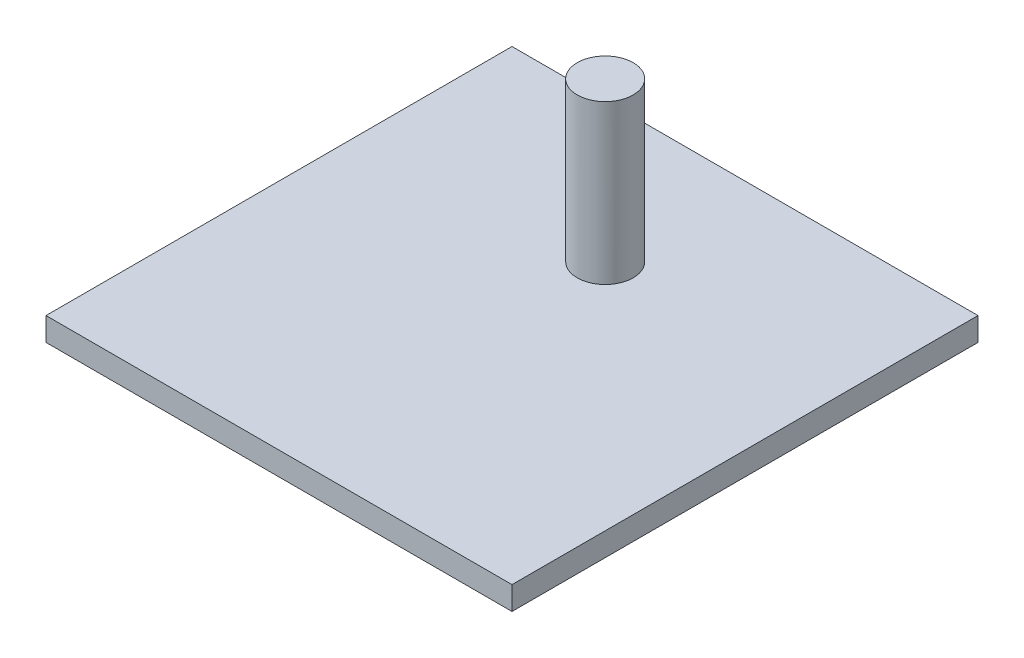
ISO-10303-21;
HEADER;
FILE_DESCRIPTION(('STEP AP214'),'2;1');
FILE_NAME('part.step','',(''),(''),'','','');
FILE_SCHEMA(('AUTOMOTIVE_DESIGN { 1 0 10303 214 1 1 1 1 }'));
ENDSEC;
DATA;
#1=APPLICATION_CONTEXT('core data for automotive mechanical design processes');
#2=APPLICATION_PROTOCOL_DEFINITION('international standard','automotive_design',2000,#1);
#3=PRODUCT_CONTEXT('',#1,'mechanical');
#4=PRODUCT('Part','Part','',(#3));
#5=PRODUCT_RELATED_PRODUCT_CATEGORY('part','',(#4));
#6=PRODUCT_DEFINITION_FORMATION('','',#4);
#7=PRODUCT_DEFINITION_CONTEXT('part definition',#1,'design');
#8=PRODUCT_DEFINITION('design','',#6,#7);
#9=PRODUCT_DEFINITION_SHAPE('','',#8);
#10=(LENGTH_UNIT() NAMED_UNIT(*) SI_UNIT(.MILLI.,.METRE.));
#11=(NAMED_UNIT(*) PLANE_ANGLE_UNIT() SI_UNIT($,.RADIAN.));
#12=(NAMED_UNIT(*) SI_UNIT($,.STERADIAN.) SOLID_ANGLE_UNIT());
#13=UNCERTAINTY_MEASURE_WITH_UNIT(LENGTH_MEASURE(1.E-05),#10,'distance_accuracy_value','');
#14=(GEOMETRIC_REPRESENTATION_CONTEXT(3) GLOBAL_UNCERTAINTY_ASSIGNED_CONTEXT((#13)) GLOBAL_UNIT_ASSIGNED_CONTEXT((#10,
#11,#12)) REPRESENTATION_CONTEXT('',''));
#15=CARTESIAN_POINT('',(0.,0.,0.));
#16=DIRECTION('',(0.,0.,1.));
#17=DIRECTION('',(1.,0.,0.));
#18=AXIS2_PLACEMENT_3D('',#15,#16,#17);
#19=CARTESIAN_POINT('',(0.,10.,-200.));
#20=DIRECTION('',(0.,-1.,0.));
#21=DIRECTION('',(0.,0.,-1.));
#22=AXIS2_PLACEMENT_3D('',#19,#20,#21);
#23=PLANE('',#22);
#24=DIRECTION('',(0.,0.,1.));
#25=VECTOR('',#24,1.);
#26=CARTESIAN_POINT('',(0.,10.,0.));
#27=LINE('',#26,#25);
#28=CARTESIAN_POINT('',(0.,10.,-200.));
#29=VERTEX_POINT('',#28);
#30=CARTESIAN_POINT('',(0.,10.,0.));
#31=VERTEX_POINT('',#30);
#32=EDGE_CURVE('E86',#29,#31,#27,.T.);
#33=ORIENTED_EDGE('',*,*,#32,.T.);
#34=DIRECTION('',(1.,0.,0.));
#35=VECTOR('',#34,1.);
#36=CARTESIAN_POINT('',(0.,10.,0.));
#37=LINE('',#36,#35);
#38=CARTESIAN_POINT('',(200.,10.,0.));
#39=VERTEX_POINT('',#38);
#40=EDGE_CURVE('E81',#31,#39,#37,.T.);
#41=ORIENTED_EDGE('',*,*,#40,.T.);
#42=DIRECTION('',(0.,0.,-1.));
#43=VECTOR('',#42,1.);
#44=CARTESIAN_POINT('',(200.,10.,0.));
#45=LINE('',#44,#43);
#46=CARTESIAN_POINT('',(200.,10.,-200.));
#47=VERTEX_POINT('',#46);
#48=EDGE_CURVE('E84',#39,#47,#45,.T.);
#49=ORIENTED_EDGE('',*,*,#48,.T.);
#50=DIRECTION('',(-1.,0.,0.));
#51=VECTOR('',#50,1.);
#52=CARTESIAN_POINT('',(0.,10.,-200.));
#53=LINE('',#52,#51);
#54=EDGE_CURVE('E50',#47,#29,#53,.T.);
#55=ORIENTED_EDGE('',*,*,#54,.T.);
#56=EDGE_LOOP('',(#33,#41,#49,#55));
#57=FACE_BOUND('',#56,.T.);
#58=CARTESIAN_POINT('',(100.,9.99999999999999,-140.));
#59=DIRECTION('',(0.,-1.,0.));
#60=DIRECTION('',(0.,0.,-1.));
#61=AXIS2_PLACEMENT_3D('',#58,#59,#60);
#62=CIRCLE('',#61,12.);
#63=CARTESIAN_POINT('',(100.,9.99999999999999,-152.));
#64=VERTEX_POINT('',#63);
#65=EDGE_CURVE('E11',#64,#64,#62,.F.);
#66=ORIENTED_EDGE('',*,*,#65,.F.);
#67=EDGE_LOOP('',(#66));
#68=FACE_BOUND('',#67,.T.);
#69=ADVANCED_FACE('F33',(#57,#68),#23,.F.);
#70=CARTESIAN_POINT('',(0.,10.,0.));
#71=DIRECTION('',(1.,0.,0.));
#72=DIRECTION('',(0.,0.,-1.));
#73=AXIS2_PLACEMENT_3D('',#70,#71,#72);
#74=PLANE('',#73);
#75=DIRECTION('',(0.,0.,1.));
#76=VECTOR('',#75,1.);
#77=CARTESIAN_POINT('',(0.,0.,0.));
#78=LINE('',#77,#76);
#79=CARTESIAN_POINT('',(0.,0.,-200.));
#80=VERTEX_POINT('',#79);
#81=CARTESIAN_POINT('',(0.,0.,0.));
#82=VERTEX_POINT('',#81);
#83=EDGE_CURVE('E100',#80,#82,#78,.T.);
#84=ORIENTED_EDGE('',*,*,#83,.T.);
#85=DIRECTION('',(0.,-1.,0.));
#86=VECTOR('',#85,1.);
#87=CARTESIAN_POINT('',(0.,10.,0.));
#88=LINE('',#87,#86);
#89=EDGE_CURVE('E42',#31,#82,#88,.T.);
#90=ORIENTED_EDGE('',*,*,#89,.F.);
#91=ORIENTED_EDGE('',*,*,#32,.F.);
#92=DIRECTION('',(0.,-1.,0.));
#93=VECTOR('',#92,1.);
#94=CARTESIAN_POINT('',(0.,10.,-200.));
#95=LINE('',#94,#93);
#96=EDGE_CURVE('E96',#29,#80,#95,.T.);
#97=ORIENTED_EDGE('',*,*,#96,.T.);
#98=EDGE_LOOP('',(#84,#90,#91,#97));
#99=FACE_BOUND('',#98,.T.);
#100=ADVANCED_FACE('F35',(#99),#74,.F.);
#101=CARTESIAN_POINT('',(0.,10.,0.));
#102=DIRECTION('',(0.,0.,-1.));
#103=DIRECTION('',(-1.,0.,0.));
#104=AXIS2_PLACEMENT_3D('',#101,#102,#103);
#105=PLANE('',#104);
#106=DIRECTION('',(1.,0.,0.));
#107=VECTOR('',#106,1.);
#108=CARTESIAN_POINT('',(0.,0.,0.));
#109=LINE('',#108,#107);
#110=CARTESIAN_POINT('',(200.,0.,0.));
#111=VERTEX_POINT('',#110);
#112=EDGE_CURVE('E91',#82,#111,#109,.T.);
#113=ORIENTED_EDGE('',*,*,#112,.T.);
#114=DIRECTION('',(0.,-1.,0.));
#115=VECTOR('',#114,1.);
#116=CARTESIAN_POINT('',(200.,10.,0.));
#117=LINE('',#116,#115);
#118=EDGE_CURVE('E89',#39,#111,#117,.T.);
#119=ORIENTED_EDGE('',*,*,#118,.F.);
#120=ORIENTED_EDGE('',*,*,#40,.F.);
#121=ORIENTED_EDGE('',*,*,#89,.T.);
#122=EDGE_LOOP('',(#113,#119,#120,#121));
#123=FACE_BOUND('',#122,.T.);
#124=ADVANCED_FACE('F90',(#123),#105,.F.);
#125=CARTESIAN_POINT('',(200.,10.,0.));
#126=DIRECTION('',(-1.,0.,0.));
#127=DIRECTION('',(0.,0.,1.));
#128=AXIS2_PLACEMENT_3D('',#125,#126,#127);
#129=PLANE('',#128);
#130=DIRECTION('',(0.,0.,-1.));
#131=VECTOR('',#130,1.);
#132=CARTESIAN_POINT('',(200.,0.,0.));
#133=LINE('',#132,#131);
#134=CARTESIAN_POINT('',(200.,0.,-200.));
#135=VERTEX_POINT('',#134);
#136=EDGE_CURVE('E67',#111,#135,#133,.T.);
#137=ORIENTED_EDGE('',*,*,#136,.T.);
#138=DIRECTION('',(0.,-1.,0.));
#139=VECTOR('',#138,1.);
#140=CARTESIAN_POINT('',(200.,10.,-200.));
#141=LINE('',#140,#139);
#142=EDGE_CURVE('E92',#47,#135,#141,.T.);
#143=ORIENTED_EDGE('',*,*,#142,.F.);
#144=ORIENTED_EDGE('',*,*,#48,.F.);
#145=ORIENTED_EDGE('',*,*,#118,.T.);
#146=EDGE_LOOP('',(#137,#143,#144,#145));
#147=FACE_BOUND('',#146,.T.);
#148=ADVANCED_FACE('F94',(#147),#129,.F.);
#149=CARTESIAN_POINT('',(0.,10.,-200.));
#150=DIRECTION('',(0.,0.,1.));
#151=DIRECTION('',(1.,0.,0.));
#152=AXIS2_PLACEMENT_3D('',#149,#150,#151);
#153=PLANE('',#152);
#154=DIRECTION('',(-1.,0.,0.));
#155=VECTOR('',#154,1.);
#156=CARTESIAN_POINT('',(0.,0.,-200.));
#157=LINE('',#156,#155);
#158=EDGE_CURVE('E73',#135,#80,#157,.T.);
#159=ORIENTED_EDGE('',*,*,#158,.T.);
#160=ORIENTED_EDGE('',*,*,#96,.F.);
#161=ORIENTED_EDGE('',*,*,#54,.F.);
#162=ORIENTED_EDGE('',*,*,#142,.T.);
#163=EDGE_LOOP('',(#159,#160,#161,#162));
#164=FACE_BOUND('',#163,.T.);
#165=ADVANCED_FACE('F114',(#164),#153,.F.);
#166=CARTESIAN_POINT('',(0.,0.,-200.));
#167=DIRECTION('',(0.,-1.,0.));
#168=DIRECTION('',(0.,0.,-1.));
#169=AXIS2_PLACEMENT_3D('',#166,#167,#168);
#170=PLANE('',#169);
#171=ORIENTED_EDGE('',*,*,#83,.F.);
#172=ORIENTED_EDGE('',*,*,#158,.F.);
#173=ORIENTED_EDGE('',*,*,#136,.F.);
#174=ORIENTED_EDGE('',*,*,#112,.F.);
#175=EDGE_LOOP('',(#171,#172,#173,#174));
#176=FACE_BOUND('',#175,.T.);
#177=ADVANCED_FACE('F111',(#176),#170,.T.);
#178=CARTESIAN_POINT('',(100.,78.,-140.));
#179=DIRECTION('',(0.,-1.,0.));
#180=DIRECTION('',(0.,0.,-1.));
#181=AXIS2_PLACEMENT_3D('',#178,#179,#180);
#182=CYLINDRICAL_SURFACE('',#181,12.);
#183=CARTESIAN_POINT('',(100.,78.,-140.));
#184=DIRECTION('',(0.,1.,0.));
#185=DIRECTION('',(0.,0.,1.));
#186=AXIS2_PLACEMENT_3D('',#183,#184,#185);
#187=CIRCLE('',#186,12.);
#188=CARTESIAN_POINT('',(100.,78.,-128.));
#189=VERTEX_POINT('',#188);
#190=EDGE_CURVE('E103',#189,#189,#187,.T.);
#191=ORIENTED_EDGE('',*,*,#190,.F.);
#192=EDGE_LOOP('',(#191));
#193=FACE_BOUND('',#192,.T.);
#194=ORIENTED_EDGE('',*,*,#65,.T.);
#195=EDGE_LOOP('',(#194));
#196=FACE_BOUND('',#195,.T.);
#197=ADVANCED_FACE('F113',(#193,#196),#182,.T.);
#198=CARTESIAN_POINT('',(100.,78.,-140.));
#199=DIRECTION('',(0.,1.,0.));
#200=DIRECTION('',(0.,0.,1.));
#201=AXIS2_PLACEMENT_3D('',#198,#199,#200);
#202=PLANE('',#201);
#203=ORIENTED_EDGE('',*,*,#190,.T.);
#204=EDGE_LOOP('',(#203));
#205=FACE_BOUND('',#204,.T.);
#206=ADVANCED_FACE('F120',(#205),#202,.T.);
#207=CLOSED_SHELL('',(#69,#100,#124,#148,#165,#177,#197,#206));
#208=MANIFOLD_SOLID_BREP('B2',#207);
#209=ADVANCED_BREP_SHAPE_REPRESENTATION('',(#18,#208),#14);
#210=SHAPE_DEFINITION_REPRESENTATION(#9,#209);
ENDSEC;
END-ISO-10303-21;
